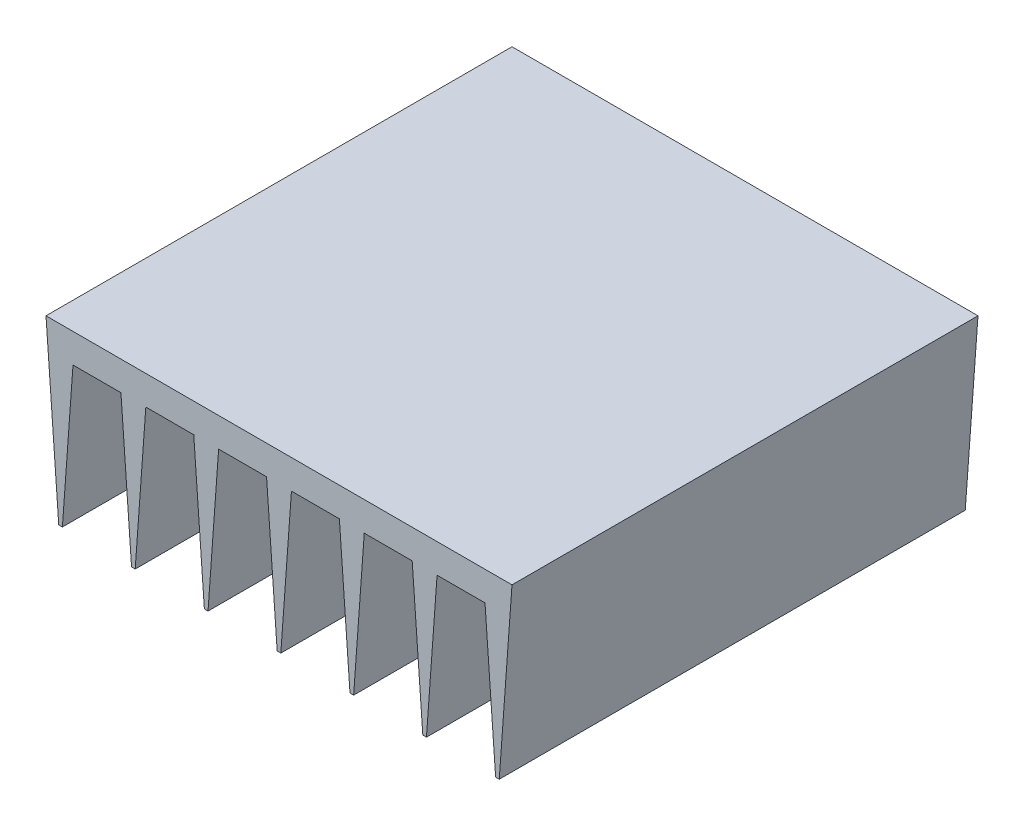
ISO-10303-21;
HEADER;
FILE_DESCRIPTION(('STEP AP214'),'2;1');
FILE_NAME('part.step','',(''),(''),'','','');
FILE_SCHEMA(('AUTOMOTIVE_DESIGN { 1 0 10303 214 1 1 1 1 }'));
ENDSEC;
DATA;
#1=APPLICATION_CONTEXT('core data for automotive mechanical design processes');
#2=APPLICATION_PROTOCOL_DEFINITION('international standard','automotive_design',2000,#1);
#3=PRODUCT_CONTEXT('',#1,'mechanical');
#4=PRODUCT('Part','Part','',(#3));
#5=PRODUCT_RELATED_PRODUCT_CATEGORY('part','',(#4));
#6=PRODUCT_DEFINITION_FORMATION('','',#4);
#7=PRODUCT_DEFINITION_CONTEXT('part definition',#1,'design');
#8=PRODUCT_DEFINITION('design','',#6,#7);
#9=PRODUCT_DEFINITION_SHAPE('','',#8);
#10=(LENGTH_UNIT() NAMED_UNIT(*) SI_UNIT(.MILLI.,.METRE.));
#11=(NAMED_UNIT(*) PLANE_ANGLE_UNIT() SI_UNIT($,.RADIAN.));
#12=(NAMED_UNIT(*) SI_UNIT($,.STERADIAN.) SOLID_ANGLE_UNIT());
#13=UNCERTAINTY_MEASURE_WITH_UNIT(LENGTH_MEASURE(1.E-05),#10,'distance_accuracy_value','');
#14=(GEOMETRIC_REPRESENTATION_CONTEXT(3) GLOBAL_UNCERTAINTY_ASSIGNED_CONTEXT((#13)) GLOBAL_UNIT_ASSIGNED_CONTEXT((#10,
#11,#12)) REPRESENTATION_CONTEXT('',''));
#15=CARTESIAN_POINT('',(0.,0.,0.));
#16=DIRECTION('',(0.,0.,1.));
#17=DIRECTION('',(1.,0.,0.));
#18=AXIS2_PLACEMENT_3D('',#15,#16,#17);
#19=CARTESIAN_POINT('',(-25.4,0.,25.4));
#20=DIRECTION('',(0.,-1.,0.));
#21=DIRECTION('',(1.,0.,0.));
#22=AXIS2_PLACEMENT_3D('',#19,#20,#21);
#23=PLANE('',#22);
#24=DIRECTION('',(-1.,0.,0.));
#25=VECTOR('',#24,1.);
#26=CARTESIAN_POINT('',(-25.4,0.,-25.4));
#27=LINE('',#26,#25);
#28=CARTESIAN_POINT('',(25.4,0.,-25.4));
#29=VERTEX_POINT('',#28);
#30=CARTESIAN_POINT('',(-25.4,0.,-25.4));
#31=VERTEX_POINT('',#30);
#32=EDGE_CURVE('E249',#29,#31,#27,.T.);
#33=ORIENTED_EDGE('',*,*,#32,.T.);
#34=DIRECTION('',(0.,0.,-1.));
#35=VECTOR('',#34,1.);
#36=CARTESIAN_POINT('',(-25.4,0.,25.4));
#37=LINE('',#36,#35);
#38=CARTESIAN_POINT('',(-25.4,0.,25.4));
#39=VERTEX_POINT('',#38);
#40=EDGE_CURVE('E11',#39,#31,#37,.T.);
#41=ORIENTED_EDGE('',*,*,#40,.F.);
#42=DIRECTION('',(-1.,0.,0.));
#43=VECTOR('',#42,1.);
#44=CARTESIAN_POINT('',(-25.4,0.,25.4));
#45=LINE('',#44,#43);
#46=CARTESIAN_POINT('',(25.4,0.,25.4));
#47=VERTEX_POINT('',#46);
#48=EDGE_CURVE('E303',#47,#39,#45,.T.);
#49=ORIENTED_EDGE('',*,*,#48,.F.);
#50=DIRECTION('',(0.,0.,-1.));
#51=VECTOR('',#50,1.);
#52=CARTESIAN_POINT('',(25.4,0.,25.4));
#53=LINE('',#52,#51);
#54=EDGE_CURVE('E245',#47,#29,#53,.T.);
#55=ORIENTED_EDGE('',*,*,#54,.T.);
#56=EDGE_LOOP('',(#33,#41,#49,#55));
#57=FACE_BOUND('',#56,.T.);
#58=ADVANCED_FACE('F33',(#57),#23,.F.);
#59=CARTESIAN_POINT('',(-25.4,0.,25.4));
#60=DIRECTION('',(0.997352133906082,0.0727235930973187,0.));
#61=DIRECTION('',(-0.0727235930973187,0.997352133906082,0.));
#62=AXIS2_PLACEMENT_3D('',#59,#60,#61);
#63=PLANE('',#62);
#64=DIRECTION('',(0.0727235930973187,-0.997352133906082,0.));
#65=VECTOR('',#64,1.);
#66=CARTESIAN_POINT('',(-25.4,0.,-25.4));
#67=LINE('',#66,#65);
#68=CARTESIAN_POINT('',(-24.0109375,-19.05,-25.4));
#69=VERTEX_POINT('',#68);
#70=EDGE_CURVE('E252',#31,#69,#67,.T.);
#71=ORIENTED_EDGE('',*,*,#70,.T.);
#72=DIRECTION('',(0.,0.,-1.));
#73=VECTOR('',#72,1.);
#74=CARTESIAN_POINT('',(-24.0109375,-19.05,25.4));
#75=LINE('',#74,#73);
#76=CARTESIAN_POINT('',(-24.0109375,-19.05,25.4));
#77=VERTEX_POINT('',#76);
#78=EDGE_CURVE('E41',#77,#69,#75,.T.);
#79=ORIENTED_EDGE('',*,*,#78,.F.);
#80=DIRECTION('',(0.0727235930973187,-0.997352133906082,0.));
#81=VECTOR('',#80,1.);
#82=CARTESIAN_POINT('',(-25.4,0.,25.4));
#83=LINE('',#82,#81);
#84=EDGE_CURVE('E152',#39,#77,#83,.T.);
#85=ORIENTED_EDGE('',*,*,#84,.F.);
#86=ORIENTED_EDGE('',*,*,#40,.T.);
#87=EDGE_LOOP('',(#71,#79,#85,#86));
#88=FACE_BOUND('',#87,.T.);
#89=ADVANCED_FACE('F461',(#88),#63,.F.);
#90=CARTESIAN_POINT('',(-24.0109375,-19.05,25.4));
#91=DIRECTION('',(0.,1.,0.));
#92=DIRECTION('',(0.,0.,1.));
#93=AXIS2_PLACEMENT_3D('',#90,#91,#92);
#94=PLANE('',#93);
#95=DIRECTION('',(1.,0.,0.));
#96=VECTOR('',#95,1.);
#97=CARTESIAN_POINT('',(-24.0109375,-19.05,-25.4));
#98=LINE('',#97,#96);
#99=CARTESIAN_POINT('',(-23.6140625,-19.05,-25.4));
#100=VERTEX_POINT('',#99);
#101=EDGE_CURVE('E254',#69,#100,#98,.T.);
#102=ORIENTED_EDGE('',*,*,#101,.T.);
#103=DIRECTION('',(0.,0.,-1.));
#104=VECTOR('',#103,1.);
#105=CARTESIAN_POINT('',(-23.6140625,-19.05,25.4));
#106=LINE('',#105,#104);
#107=CARTESIAN_POINT('',(-23.6140625,-19.05,25.4));
#108=VERTEX_POINT('',#107);
#109=EDGE_CURVE('E370',#108,#100,#106,.T.);
#110=ORIENTED_EDGE('',*,*,#109,.F.);
#111=DIRECTION('',(1.,0.,0.));
#112=VECTOR('',#111,1.);
#113=CARTESIAN_POINT('',(-24.0109375,-19.05,25.4));
#114=LINE('',#113,#112);
#115=EDGE_CURVE('E378',#77,#108,#114,.T.);
#116=ORIENTED_EDGE('',*,*,#115,.F.);
#117=ORIENTED_EDGE('',*,*,#78,.T.);
#118=EDGE_LOOP('',(#102,#110,#116,#117));
#119=FACE_BOUND('',#118,.T.);
#120=ADVANCED_FACE('F376',(#119),#94,.F.);
#121=CARTESIAN_POINT('',(-22.4565104166667,-3.175,25.4));
#122=DIRECTION('',(-0.997352133906082,0.0727235930973184,0.));
#123=DIRECTION('',(-0.0727235930973184,-0.997352133906082,0.));
#124=AXIS2_PLACEMENT_3D('',#121,#122,#123);
#125=PLANE('',#124);
#126=DIRECTION('',(0.0727235930973184,0.997352133906082,0.));
#127=VECTOR('',#126,1.);
#128=CARTESIAN_POINT('',(-22.4565104166667,-3.175,-25.4));
#129=LINE('',#128,#127);
#130=CARTESIAN_POINT('',(-22.4565104166667,-3.175,-25.4));
#131=VERTEX_POINT('',#130);
#132=EDGE_CURVE('E256',#100,#131,#129,.T.);
#133=ORIENTED_EDGE('',*,*,#132,.T.);
#134=DIRECTION('',(0.,0.,-1.));
#135=VECTOR('',#134,1.);
#136=CARTESIAN_POINT('',(-22.4565104166667,-3.175,25.4));
#137=LINE('',#136,#135);
#138=CARTESIAN_POINT('',(-22.4565104166667,-3.175,25.4));
#139=VERTEX_POINT('',#138);
#140=EDGE_CURVE('E367',#139,#131,#137,.T.);
#141=ORIENTED_EDGE('',*,*,#140,.F.);
#142=DIRECTION('',(0.0727235930973184,0.997352133906082,0.));
#143=VECTOR('',#142,1.);
#144=CARTESIAN_POINT('',(-22.4565104166667,-3.175,25.4));
#145=LINE('',#144,#143);
#146=EDGE_CURVE('E396',#108,#139,#145,.T.);
#147=ORIENTED_EDGE('',*,*,#146,.F.);
#148=ORIENTED_EDGE('',*,*,#109,.T.);
#149=EDGE_LOOP('',(#133,#141,#147,#148));
#150=FACE_BOUND('',#149,.T.);
#151=ADVANCED_FACE('F387',(#150),#125,.F.);
#152=CARTESIAN_POINT('',(-22.4565104166667,-3.175,25.4));
#153=DIRECTION('',(0.,1.,0.));
#154=DIRECTION('',(0.,0.,1.));
#155=AXIS2_PLACEMENT_3D('',#152,#153,#154);
#156=PLANE('',#155);
#157=DIRECTION('',(1.,0.,0.));
#158=VECTOR('',#157,1.);
#159=CARTESIAN_POINT('',(-22.4565104166667,-3.175,-25.4));
#160=LINE('',#159,#158);
#161=CARTESIAN_POINT('',(-17.2309895833333,-3.175,-25.4));
#162=VERTEX_POINT('',#161);
#163=EDGE_CURVE('E258',#131,#162,#160,.T.);
#164=ORIENTED_EDGE('',*,*,#163,.T.);
#165=DIRECTION('',(0.,0.,-1.));
#166=VECTOR('',#165,1.);
#167=CARTESIAN_POINT('',(-17.2309895833333,-3.175,25.4));
#168=LINE('',#167,#166);
#169=CARTESIAN_POINT('',(-17.2309895833333,-3.175,25.4));
#170=VERTEX_POINT('',#169);
#171=EDGE_CURVE('E364',#170,#162,#168,.T.);
#172=ORIENTED_EDGE('',*,*,#171,.F.);
#173=DIRECTION('',(1.,0.,0.));
#174=VECTOR('',#173,1.);
#175=CARTESIAN_POINT('',(-22.4565104166667,-3.175,25.4));
#176=LINE('',#175,#174);
#177=EDGE_CURVE('E393',#139,#170,#176,.T.);
#178=ORIENTED_EDGE('',*,*,#177,.F.);
#179=ORIENTED_EDGE('',*,*,#140,.T.);
#180=EDGE_LOOP('',(#164,#172,#178,#179));
#181=FACE_BOUND('',#180,.T.);
#182=ADVANCED_FACE('F391',(#181),#156,.F.);
#183=CARTESIAN_POINT('',(-17.2309895833333,-3.175,25.4));
#184=DIRECTION('',(0.997352133906082,0.0727235930973187,0.));
#185=DIRECTION('',(-0.0727235930973187,0.997352133906082,0.));
#186=AXIS2_PLACEMENT_3D('',#183,#184,#185);
#187=PLANE('',#186);
#188=DIRECTION('',(0.0727235930973187,-0.997352133906082,0.));
#189=VECTOR('',#188,1.);
#190=CARTESIAN_POINT('',(-17.2309895833333,-3.175,-25.4));
#191=LINE('',#190,#189);
#192=CARTESIAN_POINT('',(-16.0734375,-19.05,-25.4));
#193=VERTEX_POINT('',#192);
#194=EDGE_CURVE('E260',#162,#193,#191,.T.);
#195=ORIENTED_EDGE('',*,*,#194,.T.);
#196=DIRECTION('',(0.,0.,-1.));
#197=VECTOR('',#196,1.);
#198=CARTESIAN_POINT('',(-16.0734375,-19.05,25.4));
#199=LINE('',#198,#197);
#200=CARTESIAN_POINT('',(-16.0734375,-19.05,25.4));
#201=VERTEX_POINT('',#200);
#202=EDGE_CURVE('E361',#201,#193,#199,.T.);
#203=ORIENTED_EDGE('',*,*,#202,.F.);
#204=DIRECTION('',(0.0727235930973187,-0.997352133906082,0.));
#205=VECTOR('',#204,1.);
#206=CARTESIAN_POINT('',(-17.2309895833333,-3.175,25.4));
#207=LINE('',#206,#205);
#208=EDGE_CURVE('E395',#170,#201,#207,.T.);
#209=ORIENTED_EDGE('',*,*,#208,.F.);
#210=ORIENTED_EDGE('',*,*,#171,.T.);
#211=EDGE_LOOP('',(#195,#203,#209,#210));
#212=FACE_BOUND('',#211,.T.);
#213=ADVANCED_FACE('F474',(#212),#187,.F.);
#214=CARTESIAN_POINT('',(-16.0734375,-19.05,25.4));
#215=DIRECTION('',(0.,1.,0.));
#216=DIRECTION('',(0.,0.,1.));
#217=AXIS2_PLACEMENT_3D('',#214,#215,#216);
#218=PLANE('',#217);
#219=DIRECTION('',(1.,0.,0.));
#220=VECTOR('',#219,1.);
#221=CARTESIAN_POINT('',(-16.0734375,-19.05,-25.4));
#222=LINE('',#221,#220);
#223=CARTESIAN_POINT('',(-15.6765625,-19.05,-25.4));
#224=VERTEX_POINT('',#223);
#225=EDGE_CURVE('E262',#193,#224,#222,.T.);
#226=ORIENTED_EDGE('',*,*,#225,.T.);
#227=DIRECTION('',(0.,0.,-1.));
#228=VECTOR('',#227,1.);
#229=CARTESIAN_POINT('',(-15.6765625,-19.05,25.4));
#230=LINE('',#229,#228);
#231=CARTESIAN_POINT('',(-15.6765625,-19.05,25.4));
#232=VERTEX_POINT('',#231);
#233=EDGE_CURVE('E358',#232,#224,#230,.T.);
#234=ORIENTED_EDGE('',*,*,#233,.F.);
#235=DIRECTION('',(1.,0.,0.));
#236=VECTOR('',#235,1.);
#237=CARTESIAN_POINT('',(-16.0734375,-19.05,25.4));
#238=LINE('',#237,#236);
#239=EDGE_CURVE('E398',#201,#232,#238,.T.);
#240=ORIENTED_EDGE('',*,*,#239,.F.);
#241=ORIENTED_EDGE('',*,*,#202,.T.);
#242=EDGE_LOOP('',(#226,#234,#240,#241));
#243=FACE_BOUND('',#242,.T.);
#244=ADVANCED_FACE('F477',(#243),#218,.F.);
#245=CARTESIAN_POINT('',(-14.5190104166667,-3.175,25.4));
#246=DIRECTION('',(-0.997352133906082,0.0727235930973184,0.));
#247=DIRECTION('',(-0.0727235930973184,-0.997352133906082,0.));
#248=AXIS2_PLACEMENT_3D('',#245,#246,#247);
#249=PLANE('',#248);
#250=DIRECTION('',(0.0727235930973184,0.997352133906082,0.));
#251=VECTOR('',#250,1.);
#252=CARTESIAN_POINT('',(-14.5190104166667,-3.175,-25.4));
#253=LINE('',#252,#251);
#254=CARTESIAN_POINT('',(-14.5190104166667,-3.175,-25.4));
#255=VERTEX_POINT('',#254);
#256=EDGE_CURVE('E264',#224,#255,#253,.T.);
#257=ORIENTED_EDGE('',*,*,#256,.T.);
#258=DIRECTION('',(0.,0.,-1.));
#259=VECTOR('',#258,1.);
#260=CARTESIAN_POINT('',(-14.5190104166667,-3.175,25.4));
#261=LINE('',#260,#259);
#262=CARTESIAN_POINT('',(-14.5190104166667,-3.175,25.4));
#263=VERTEX_POINT('',#262);
#264=EDGE_CURVE('E355',#263,#255,#261,.T.);
#265=ORIENTED_EDGE('',*,*,#264,.F.);
#266=DIRECTION('',(0.0727235930973184,0.997352133906082,0.));
#267=VECTOR('',#266,1.);
#268=CARTESIAN_POINT('',(-14.5190104166667,-3.175,25.4));
#269=LINE('',#268,#267);
#270=EDGE_CURVE('E404',#232,#263,#269,.T.);
#271=ORIENTED_EDGE('',*,*,#270,.F.);
#272=ORIENTED_EDGE('',*,*,#233,.T.);
#273=EDGE_LOOP('',(#257,#265,#271,#272));
#274=FACE_BOUND('',#273,.T.);
#275=ADVANCED_FACE('F481',(#274),#249,.F.);
#276=CARTESIAN_POINT('',(-14.5190104166667,-3.175,25.4));
#277=DIRECTION('',(0.,1.,0.));
#278=DIRECTION('',(0.,0.,1.));
#279=AXIS2_PLACEMENT_3D('',#276,#277,#278);
#280=PLANE('',#279);
#281=DIRECTION('',(1.,0.,0.));
#282=VECTOR('',#281,1.);
#283=CARTESIAN_POINT('',(-14.5190104166667,-3.175,-25.4));
#284=LINE('',#283,#282);
#285=CARTESIAN_POINT('',(-9.29348958333333,-3.175,-25.4));
#286=VERTEX_POINT('',#285);
#287=EDGE_CURVE('E266',#255,#286,#284,.T.);
#288=ORIENTED_EDGE('',*,*,#287,.T.);
#289=DIRECTION('',(0.,0.,-1.));
#290=VECTOR('',#289,1.);
#291=CARTESIAN_POINT('',(-9.29348958333333,-3.175,25.4));
#292=LINE('',#291,#290);
#293=CARTESIAN_POINT('',(-9.29348958333333,-3.175,25.4));
#294=VERTEX_POINT('',#293);
#295=EDGE_CURVE('E352',#294,#286,#292,.T.);
#296=ORIENTED_EDGE('',*,*,#295,.F.);
#297=DIRECTION('',(1.,0.,0.));
#298=VECTOR('',#297,1.);
#299=CARTESIAN_POINT('',(-14.5190104166667,-3.175,25.4));
#300=LINE('',#299,#298);
#301=EDGE_CURVE('E406',#263,#294,#300,.T.);
#302=ORIENTED_EDGE('',*,*,#301,.F.);
#303=ORIENTED_EDGE('',*,*,#264,.T.);
#304=EDGE_LOOP('',(#288,#296,#302,#303));
#305=FACE_BOUND('',#304,.T.);
#306=ADVANCED_FACE('F485',(#305),#280,.F.);
#307=CARTESIAN_POINT('',(-9.29348958333333,-3.175,25.4));
#308=DIRECTION('',(0.997352133906082,0.0727235930973187,0.));
#309=DIRECTION('',(-0.0727235930973187,0.997352133906082,0.));
#310=AXIS2_PLACEMENT_3D('',#307,#308,#309);
#311=PLANE('',#310);
#312=DIRECTION('',(0.0727235930973187,-0.997352133906082,0.));
#313=VECTOR('',#312,1.);
#314=CARTESIAN_POINT('',(-9.29348958333333,-3.175,-25.4));
#315=LINE('',#314,#313);
#316=CARTESIAN_POINT('',(-8.1359375,-19.05,-25.4));
#317=VERTEX_POINT('',#316);
#318=EDGE_CURVE('E268',#286,#317,#315,.T.);
#319=ORIENTED_EDGE('',*,*,#318,.T.);
#320=DIRECTION('',(0.,0.,-1.));
#321=VECTOR('',#320,1.);
#322=CARTESIAN_POINT('',(-8.1359375,-19.05,25.4));
#323=LINE('',#322,#321);
#324=CARTESIAN_POINT('',(-8.1359375,-19.05,25.4));
#325=VERTEX_POINT('',#324);
#326=EDGE_CURVE('E349',#325,#317,#323,.T.);
#327=ORIENTED_EDGE('',*,*,#326,.F.);
#328=DIRECTION('',(0.0727235930973187,-0.997352133906082,0.));
#329=VECTOR('',#328,1.);
#330=CARTESIAN_POINT('',(-9.29348958333333,-3.175,25.4));
#331=LINE('',#330,#329);
#332=EDGE_CURVE('E408',#294,#325,#331,.T.);
#333=ORIENTED_EDGE('',*,*,#332,.F.);
#334=ORIENTED_EDGE('',*,*,#295,.T.);
#335=EDGE_LOOP('',(#319,#327,#333,#334));
#336=FACE_BOUND('',#335,.T.);
#337=ADVANCED_FACE('F489',(#336),#311,.F.);
#338=CARTESIAN_POINT('',(-8.1359375,-19.05,25.4));
#339=DIRECTION('',(0.,1.,0.));
#340=DIRECTION('',(0.,0.,1.));
#341=AXIS2_PLACEMENT_3D('',#338,#339,#340);
#342=PLANE('',#341);
#343=DIRECTION('',(1.,0.,0.));
#344=VECTOR('',#343,1.);
#345=CARTESIAN_POINT('',(-8.1359375,-19.05,-25.4));
#346=LINE('',#345,#344);
#347=CARTESIAN_POINT('',(-7.7390625,-19.05,-25.4));
#348=VERTEX_POINT('',#347);
#349=EDGE_CURVE('E270',#317,#348,#346,.T.);
#350=ORIENTED_EDGE('',*,*,#349,.T.);
#351=DIRECTION('',(0.,0.,-1.));
#352=VECTOR('',#351,1.);
#353=CARTESIAN_POINT('',(-7.7390625,-19.05,25.4));
#354=LINE('',#353,#352);
#355=CARTESIAN_POINT('',(-7.7390625,-19.05,25.4));
#356=VERTEX_POINT('',#355);
#357=EDGE_CURVE('E346',#356,#348,#354,.T.);
#358=ORIENTED_EDGE('',*,*,#357,.F.);
#359=DIRECTION('',(1.,0.,0.));
#360=VECTOR('',#359,1.);
#361=CARTESIAN_POINT('',(-8.1359375,-19.05,25.4));
#362=LINE('',#361,#360);
#363=EDGE_CURVE('E410',#325,#356,#362,.T.);
#364=ORIENTED_EDGE('',*,*,#363,.F.);
#365=ORIENTED_EDGE('',*,*,#326,.T.);
#366=EDGE_LOOP('',(#350,#358,#364,#365));
#367=FACE_BOUND('',#366,.T.);
#368=ADVANCED_FACE('F493',(#367),#342,.F.);
#369=CARTESIAN_POINT('',(-6.58151041666667,-3.175,25.4));
#370=DIRECTION('',(-0.997352133906082,0.0727235930973184,0.));
#371=DIRECTION('',(-0.0727235930973184,-0.997352133906082,0.));
#372=AXIS2_PLACEMENT_3D('',#369,#370,#371);
#373=PLANE('',#372);
#374=DIRECTION('',(0.0727235930973184,0.997352133906082,0.));
#375=VECTOR('',#374,1.);
#376=CARTESIAN_POINT('',(-6.58151041666667,-3.175,-25.4));
#377=LINE('',#376,#375);
#378=CARTESIAN_POINT('',(-6.58151041666667,-3.175,-25.4));
#379=VERTEX_POINT('',#378);
#380=EDGE_CURVE('E272',#348,#379,#377,.T.);
#381=ORIENTED_EDGE('',*,*,#380,.T.);
#382=DIRECTION('',(0.,0.,-1.));
#383=VECTOR('',#382,1.);
#384=CARTESIAN_POINT('',(-6.58151041666667,-3.175,25.4));
#385=LINE('',#384,#383);
#386=CARTESIAN_POINT('',(-6.58151041666667,-3.175,25.4));
#387=VERTEX_POINT('',#386);
#388=EDGE_CURVE('E343',#387,#379,#385,.T.);
#389=ORIENTED_EDGE('',*,*,#388,.F.);
#390=DIRECTION('',(0.0727235930973184,0.997352133906082,0.));
#391=VECTOR('',#390,1.);
#392=CARTESIAN_POINT('',(-6.58151041666667,-3.175,25.4));
#393=LINE('',#392,#391);
#394=EDGE_CURVE('E412',#356,#387,#393,.T.);
#395=ORIENTED_EDGE('',*,*,#394,.F.);
#396=ORIENTED_EDGE('',*,*,#357,.T.);
#397=EDGE_LOOP('',(#381,#389,#395,#396));
#398=FACE_BOUND('',#397,.T.);
#399=ADVANCED_FACE('F497',(#398),#373,.F.);
#400=CARTESIAN_POINT('',(-6.58151041666667,-3.175,25.4));
#401=DIRECTION('',(0.,1.,0.));
#402=DIRECTION('',(0.,0.,1.));
#403=AXIS2_PLACEMENT_3D('',#400,#401,#402);
#404=PLANE('',#403);
#405=DIRECTION('',(1.,0.,0.));
#406=VECTOR('',#405,1.);
#407=CARTESIAN_POINT('',(-6.58151041666667,-3.175,-25.4));
#408=LINE('',#407,#406);
#409=CARTESIAN_POINT('',(-1.35598958333333,-3.175,-25.4));
#410=VERTEX_POINT('',#409);
#411=EDGE_CURVE('E274',#379,#410,#408,.T.);
#412=ORIENTED_EDGE('',*,*,#411,.T.);
#413=DIRECTION('',(0.,0.,-1.));
#414=VECTOR('',#413,1.);
#415=CARTESIAN_POINT('',(-1.35598958333333,-3.175,25.4));
#416=LINE('',#415,#414);
#417=CARTESIAN_POINT('',(-1.35598958333333,-3.175,25.4));
#418=VERTEX_POINT('',#417);
#419=EDGE_CURVE('E340',#418,#410,#416,.T.);
#420=ORIENTED_EDGE('',*,*,#419,.F.);
#421=DIRECTION('',(1.,0.,0.));
#422=VECTOR('',#421,1.);
#423=CARTESIAN_POINT('',(-6.58151041666667,-3.175,25.4));
#424=LINE('',#423,#422);
#425=EDGE_CURVE('E414',#387,#418,#424,.T.);
#426=ORIENTED_EDGE('',*,*,#425,.F.);
#427=ORIENTED_EDGE('',*,*,#388,.T.);
#428=EDGE_LOOP('',(#412,#420,#426,#427));
#429=FACE_BOUND('',#428,.T.);
#430=ADVANCED_FACE('F501',(#429),#404,.F.);
#431=CARTESIAN_POINT('',(-1.35598958333333,-3.175,25.4));
#432=DIRECTION('',(0.997352133906082,0.0727235930973187,0.));
#433=DIRECTION('',(-0.0727235930973187,0.997352133906082,0.));
#434=AXIS2_PLACEMENT_3D('',#431,#432,#433);
#435=PLANE('',#434);
#436=DIRECTION('',(0.0727235930973187,-0.997352133906082,0.));
#437=VECTOR('',#436,1.);
#438=CARTESIAN_POINT('',(-1.35598958333333,-3.175,-25.4));
#439=LINE('',#438,#437);
#440=CARTESIAN_POINT('',(-0.198437499999995,-19.05,-25.4));
#441=VERTEX_POINT('',#440);
#442=EDGE_CURVE('E276',#410,#441,#439,.T.);
#443=ORIENTED_EDGE('',*,*,#442,.T.);
#444=DIRECTION('',(0.,0.,-1.));
#445=VECTOR('',#444,1.);
#446=CARTESIAN_POINT('',(-0.198437499999995,-19.05,25.4));
#447=LINE('',#446,#445);
#448=CARTESIAN_POINT('',(-0.198437499999995,-19.05,25.4));
#449=VERTEX_POINT('',#448);
#450=EDGE_CURVE('E337',#449,#441,#447,.T.);
#451=ORIENTED_EDGE('',*,*,#450,.F.);
#452=DIRECTION('',(0.0727235930973187,-0.997352133906082,0.));
#453=VECTOR('',#452,1.);
#454=CARTESIAN_POINT('',(-1.35598958333333,-3.175,25.4));
#455=LINE('',#454,#453);
#456=EDGE_CURVE('E416',#418,#449,#455,.T.);
#457=ORIENTED_EDGE('',*,*,#456,.F.);
#458=ORIENTED_EDGE('',*,*,#419,.T.);
#459=EDGE_LOOP('',(#443,#451,#457,#458));
#460=FACE_BOUND('',#459,.T.);
#461=ADVANCED_FACE('F505',(#460),#435,.F.);
#462=CARTESIAN_POINT('',(-0.198437499999995,-19.05,25.4));
#463=DIRECTION('',(0.,1.,0.));
#464=DIRECTION('',(0.,0.,1.));
#465=AXIS2_PLACEMENT_3D('',#462,#463,#464);
#466=PLANE('',#465);
#467=DIRECTION('',(1.,0.,0.));
#468=VECTOR('',#467,1.);
#469=CARTESIAN_POINT('',(-0.198437499999995,-19.05,-25.4));
#470=LINE('',#469,#468);
#471=CARTESIAN_POINT('',(0.198437500000002,-19.05,-25.4));
#472=VERTEX_POINT('',#471);
#473=EDGE_CURVE('E278',#441,#472,#470,.T.);
#474=ORIENTED_EDGE('',*,*,#473,.T.);
#475=DIRECTION('',(0.,0.,-1.));
#476=VECTOR('',#475,1.);
#477=CARTESIAN_POINT('',(0.198437500000002,-19.05,25.4));
#478=LINE('',#477,#476);
#479=CARTESIAN_POINT('',(0.198437500000002,-19.05,25.4));
#480=VERTEX_POINT('',#479);
#481=EDGE_CURVE('E334',#480,#472,#478,.T.);
#482=ORIENTED_EDGE('',*,*,#481,.F.);
#483=DIRECTION('',(1.,0.,0.));
#484=VECTOR('',#483,1.);
#485=CARTESIAN_POINT('',(-0.198437499999995,-19.05,25.4));
#486=LINE('',#485,#484);
#487=EDGE_CURVE('E418',#449,#480,#486,.T.);
#488=ORIENTED_EDGE('',*,*,#487,.F.);
#489=ORIENTED_EDGE('',*,*,#450,.T.);
#490=EDGE_LOOP('',(#474,#482,#488,#489));
#491=FACE_BOUND('',#490,.T.);
#492=ADVANCED_FACE('F509',(#491),#466,.F.);
#493=CARTESIAN_POINT('',(1.35598958333334,-3.175,25.4));
#494=DIRECTION('',(-0.997352133906082,0.0727235930973185,0.));
#495=DIRECTION('',(-0.0727235930973185,-0.997352133906082,0.));
#496=AXIS2_PLACEMENT_3D('',#493,#494,#495);
#497=PLANE('',#496);
#498=DIRECTION('',(0.0727235930973185,0.997352133906082,0.));
#499=VECTOR('',#498,1.);
#500=CARTESIAN_POINT('',(1.35598958333334,-3.175,-25.4));
#501=LINE('',#500,#499);
#502=CARTESIAN_POINT('',(1.35598958333334,-3.175,-25.4));
#503=VERTEX_POINT('',#502);
#504=EDGE_CURVE('E280',#472,#503,#501,.T.);
#505=ORIENTED_EDGE('',*,*,#504,.T.);
#506=DIRECTION('',(0.,0.,-1.));
#507=VECTOR('',#506,1.);
#508=CARTESIAN_POINT('',(1.35598958333334,-3.175,25.4));
#509=LINE('',#508,#507);
#510=CARTESIAN_POINT('',(1.35598958333334,-3.175,25.4));
#511=VERTEX_POINT('',#510);
#512=EDGE_CURVE('E331',#511,#503,#509,.T.);
#513=ORIENTED_EDGE('',*,*,#512,.F.);
#514=DIRECTION('',(0.0727235930973185,0.997352133906082,0.));
#515=VECTOR('',#514,1.);
#516=CARTESIAN_POINT('',(1.35598958333334,-3.175,25.4));
#517=LINE('',#516,#515);
#518=EDGE_CURVE('E420',#480,#511,#517,.T.);
#519=ORIENTED_EDGE('',*,*,#518,.F.);
#520=ORIENTED_EDGE('',*,*,#481,.T.);
#521=EDGE_LOOP('',(#505,#513,#519,#520));
#522=FACE_BOUND('',#521,.T.);
#523=ADVANCED_FACE('F513',(#522),#497,.F.);
#524=CARTESIAN_POINT('',(1.35598958333334,-3.175,25.4));
#525=DIRECTION('',(0.,1.,0.));
#526=DIRECTION('',(0.,0.,1.));
#527=AXIS2_PLACEMENT_3D('',#524,#525,#526);
#528=PLANE('',#527);
#529=DIRECTION('',(1.,0.,0.));
#530=VECTOR('',#529,1.);
#531=CARTESIAN_POINT('',(1.35598958333334,-3.175,-25.4));
#532=LINE('',#531,#530);
#533=CARTESIAN_POINT('',(6.58151041666667,-3.175,-25.4));
#534=VERTEX_POINT('',#533);
#535=EDGE_CURVE('E282',#503,#534,#532,.T.);
#536=ORIENTED_EDGE('',*,*,#535,.T.);
#537=DIRECTION('',(0.,0.,-1.));
#538=VECTOR('',#537,1.);
#539=CARTESIAN_POINT('',(6.58151041666667,-3.175,25.4));
#540=LINE('',#539,#538);
#541=CARTESIAN_POINT('',(6.58151041666667,-3.175,25.4));
#542=VERTEX_POINT('',#541);
#543=EDGE_CURVE('E328',#542,#534,#540,.T.);
#544=ORIENTED_EDGE('',*,*,#543,.F.);
#545=DIRECTION('',(1.,0.,0.));
#546=VECTOR('',#545,1.);
#547=CARTESIAN_POINT('',(1.35598958333334,-3.175,25.4));
#548=LINE('',#547,#546);
#549=EDGE_CURVE('E422',#511,#542,#548,.T.);
#550=ORIENTED_EDGE('',*,*,#549,.F.);
#551=ORIENTED_EDGE('',*,*,#512,.T.);
#552=EDGE_LOOP('',(#536,#544,#550,#551));
#553=FACE_BOUND('',#552,.T.);
#554=ADVANCED_FACE('F517',(#553),#528,.F.);
#555=CARTESIAN_POINT('',(6.58151041666667,-3.175,25.4));
#556=DIRECTION('',(0.997352133906082,0.0727235930973187,0.));
#557=DIRECTION('',(-0.0727235930973187,0.997352133906082,0.));
#558=AXIS2_PLACEMENT_3D('',#555,#556,#557);
#559=PLANE('',#558);
#560=DIRECTION('',(0.0727235930973187,-0.997352133906082,0.));
#561=VECTOR('',#560,1.);
#562=CARTESIAN_POINT('',(6.58151041666667,-3.175,-25.4));
#563=LINE('',#562,#561);
#564=CARTESIAN_POINT('',(7.7390625,-19.05,-25.4));
#565=VERTEX_POINT('',#564);
#566=EDGE_CURVE('E284',#534,#565,#563,.T.);
#567=ORIENTED_EDGE('',*,*,#566,.T.);
#568=DIRECTION('',(0.,0.,-1.));
#569=VECTOR('',#568,1.);
#570=CARTESIAN_POINT('',(7.7390625,-19.05,25.4));
#571=LINE('',#570,#569);
#572=CARTESIAN_POINT('',(7.7390625,-19.05,25.4));
#573=VERTEX_POINT('',#572);
#574=EDGE_CURVE('E325',#573,#565,#571,.T.);
#575=ORIENTED_EDGE('',*,*,#574,.F.);
#576=DIRECTION('',(0.0727235930973187,-0.997352133906082,0.));
#577=VECTOR('',#576,1.);
#578=CARTESIAN_POINT('',(6.58151041666667,-3.175,25.4));
#579=LINE('',#578,#577);
#580=EDGE_CURVE('E424',#542,#573,#579,.T.);
#581=ORIENTED_EDGE('',*,*,#580,.F.);
#582=ORIENTED_EDGE('',*,*,#543,.T.);
#583=EDGE_LOOP('',(#567,#575,#581,#582));
#584=FACE_BOUND('',#583,.T.);
#585=ADVANCED_FACE('F521',(#584),#559,.F.);
#586=CARTESIAN_POINT('',(7.7390625,-19.05,25.4));
#587=DIRECTION('',(0.,1.,0.));
#588=DIRECTION('',(0.,0.,1.));
#589=AXIS2_PLACEMENT_3D('',#586,#587,#588);
#590=PLANE('',#589);
#591=DIRECTION('',(1.,0.,0.));
#592=VECTOR('',#591,1.);
#593=CARTESIAN_POINT('',(7.7390625,-19.05,-25.4));
#594=LINE('',#593,#592);
#595=CARTESIAN_POINT('',(8.1359375,-19.05,-25.4));
#596=VERTEX_POINT('',#595);
#597=EDGE_CURVE('E286',#565,#596,#594,.T.);
#598=ORIENTED_EDGE('',*,*,#597,.T.);
#599=DIRECTION('',(0.,0.,-1.));
#600=VECTOR('',#599,1.);
#601=CARTESIAN_POINT('',(8.1359375,-19.05,25.4));
#602=LINE('',#601,#600);
#603=CARTESIAN_POINT('',(8.1359375,-19.05,25.4));
#604=VERTEX_POINT('',#603);
#605=EDGE_CURVE('E322',#604,#596,#602,.T.);
#606=ORIENTED_EDGE('',*,*,#605,.F.);
#607=DIRECTION('',(1.,0.,0.));
#608=VECTOR('',#607,1.);
#609=CARTESIAN_POINT('',(7.7390625,-19.05,25.4));
#610=LINE('',#609,#608);
#611=EDGE_CURVE('E426',#573,#604,#610,.T.);
#612=ORIENTED_EDGE('',*,*,#611,.F.);
#613=ORIENTED_EDGE('',*,*,#574,.T.);
#614=EDGE_LOOP('',(#598,#606,#612,#613));
#615=FACE_BOUND('',#614,.T.);
#616=ADVANCED_FACE('F525',(#615),#590,.F.);
#617=CARTESIAN_POINT('',(9.29348958333333,-3.175,25.4));
#618=DIRECTION('',(-0.997352133906082,0.0727235930973184,0.));
#619=DIRECTION('',(-0.0727235930973184,-0.997352133906082,0.));
#620=AXIS2_PLACEMENT_3D('',#617,#618,#619);
#621=PLANE('',#620);
#622=DIRECTION('',(0.0727235930973184,0.997352133906082,0.));
#623=VECTOR('',#622,1.);
#624=CARTESIAN_POINT('',(9.29348958333333,-3.175,-25.4));
#625=LINE('',#624,#623);
#626=CARTESIAN_POINT('',(9.29348958333333,-3.175,-25.4));
#627=VERTEX_POINT('',#626);
#628=EDGE_CURVE('E288',#596,#627,#625,.T.);
#629=ORIENTED_EDGE('',*,*,#628,.T.);
#630=DIRECTION('',(0.,0.,-1.));
#631=VECTOR('',#630,1.);
#632=CARTESIAN_POINT('',(9.29348958333333,-3.175,25.4));
#633=LINE('',#632,#631);
#634=CARTESIAN_POINT('',(9.29348958333333,-3.175,25.4));
#635=VERTEX_POINT('',#634);
#636=EDGE_CURVE('E319',#635,#627,#633,.T.);
#637=ORIENTED_EDGE('',*,*,#636,.F.);
#638=DIRECTION('',(0.0727235930973184,0.997352133906082,0.));
#639=VECTOR('',#638,1.);
#640=CARTESIAN_POINT('',(9.29348958333333,-3.175,25.4));
#641=LINE('',#640,#639);
#642=EDGE_CURVE('E428',#604,#635,#641,.T.);
#643=ORIENTED_EDGE('',*,*,#642,.F.);
#644=ORIENTED_EDGE('',*,*,#605,.T.);
#645=EDGE_LOOP('',(#629,#637,#643,#644));
#646=FACE_BOUND('',#645,.T.);
#647=ADVANCED_FACE('F529',(#646),#621,.F.);
#648=CARTESIAN_POINT('',(9.29348958333333,-3.175,25.4));
#649=DIRECTION('',(0.,1.,0.));
#650=DIRECTION('',(0.,0.,1.));
#651=AXIS2_PLACEMENT_3D('',#648,#649,#650);
#652=PLANE('',#651);
#653=DIRECTION('',(1.,0.,0.));
#654=VECTOR('',#653,1.);
#655=CARTESIAN_POINT('',(9.29348958333333,-3.175,-25.4));
#656=LINE('',#655,#654);
#657=CARTESIAN_POINT('',(14.5190104166667,-3.175,-25.4));
#658=VERTEX_POINT('',#657);
#659=EDGE_CURVE('E290',#627,#658,#656,.T.);
#660=ORIENTED_EDGE('',*,*,#659,.T.);
#661=DIRECTION('',(0.,0.,-1.));
#662=VECTOR('',#661,1.);
#663=CARTESIAN_POINT('',(14.5190104166667,-3.175,25.4));
#664=LINE('',#663,#662);
#665=CARTESIAN_POINT('',(14.5190104166667,-3.175,25.4));
#666=VERTEX_POINT('',#665);
#667=EDGE_CURVE('E316',#666,#658,#664,.T.);
#668=ORIENTED_EDGE('',*,*,#667,.F.);
#669=DIRECTION('',(1.,0.,0.));
#670=VECTOR('',#669,1.);
#671=CARTESIAN_POINT('',(9.29348958333333,-3.175,25.4));
#672=LINE('',#671,#670);
#673=EDGE_CURVE('E430',#635,#666,#672,.T.);
#674=ORIENTED_EDGE('',*,*,#673,.F.);
#675=ORIENTED_EDGE('',*,*,#636,.T.);
#676=EDGE_LOOP('',(#660,#668,#674,#675));
#677=FACE_BOUND('',#676,.T.);
#678=ADVANCED_FACE('F533',(#677),#652,.F.);
#679=CARTESIAN_POINT('',(14.5190104166667,-3.175,25.4));
#680=DIRECTION('',(0.997352133906082,0.0727235930973187,0.));
#681=DIRECTION('',(-0.0727235930973187,0.997352133906082,0.));
#682=AXIS2_PLACEMENT_3D('',#679,#680,#681);
#683=PLANE('',#682);
#684=DIRECTION('',(0.0727235930973187,-0.997352133906082,0.));
#685=VECTOR('',#684,1.);
#686=CARTESIAN_POINT('',(14.5190104166667,-3.175,-25.4));
#687=LINE('',#686,#685);
#688=CARTESIAN_POINT('',(15.6765625,-19.05,-25.4));
#689=VERTEX_POINT('',#688);
#690=EDGE_CURVE('E292',#658,#689,#687,.T.);
#691=ORIENTED_EDGE('',*,*,#690,.T.);
#692=DIRECTION('',(0.,0.,-1.));
#693=VECTOR('',#692,1.);
#694=CARTESIAN_POINT('',(15.6765625,-19.05,25.4));
#695=LINE('',#694,#693);
#696=CARTESIAN_POINT('',(15.6765625,-19.05,25.4));
#697=VERTEX_POINT('',#696);
#698=EDGE_CURVE('E313',#697,#689,#695,.T.);
#699=ORIENTED_EDGE('',*,*,#698,.F.);
#700=DIRECTION('',(0.0727235930973187,-0.997352133906082,0.));
#701=VECTOR('',#700,1.);
#702=CARTESIAN_POINT('',(14.5190104166667,-3.175,25.4));
#703=LINE('',#702,#701);
#704=EDGE_CURVE('E432',#666,#697,#703,.T.);
#705=ORIENTED_EDGE('',*,*,#704,.F.);
#706=ORIENTED_EDGE('',*,*,#667,.T.);
#707=EDGE_LOOP('',(#691,#699,#705,#706));
#708=FACE_BOUND('',#707,.T.);
#709=ADVANCED_FACE('F537',(#708),#683,.F.);
#710=CARTESIAN_POINT('',(15.6765625,-19.05,25.4));
#711=DIRECTION('',(0.,1.,0.));
#712=DIRECTION('',(0.,0.,1.));
#713=AXIS2_PLACEMENT_3D('',#710,#711,#712);
#714=PLANE('',#713);
#715=DIRECTION('',(1.,0.,0.));
#716=VECTOR('',#715,1.);
#717=CARTESIAN_POINT('',(15.6765625,-19.05,-25.4));
#718=LINE('',#717,#716);
#719=CARTESIAN_POINT('',(16.0734375,-19.05,-25.4));
#720=VERTEX_POINT('',#719);
#721=EDGE_CURVE('E294',#689,#720,#718,.T.);
#722=ORIENTED_EDGE('',*,*,#721,.T.);
#723=DIRECTION('',(0.,0.,-1.));
#724=VECTOR('',#723,1.);
#725=CARTESIAN_POINT('',(16.0734375,-19.05,25.4));
#726=LINE('',#725,#724);
#727=CARTESIAN_POINT('',(16.0734375,-19.05,25.4));
#728=VERTEX_POINT('',#727);
#729=EDGE_CURVE('E310',#728,#720,#726,.T.);
#730=ORIENTED_EDGE('',*,*,#729,.F.);
#731=DIRECTION('',(1.,0.,0.));
#732=VECTOR('',#731,1.);
#733=CARTESIAN_POINT('',(15.6765625,-19.05,25.4));
#734=LINE('',#733,#732);
#735=EDGE_CURVE('E434',#697,#728,#734,.T.);
#736=ORIENTED_EDGE('',*,*,#735,.F.);
#737=ORIENTED_EDGE('',*,*,#698,.T.);
#738=EDGE_LOOP('',(#722,#730,#736,#737));
#739=FACE_BOUND('',#738,.T.);
#740=ADVANCED_FACE('F541',(#739),#714,.F.);
#741=CARTESIAN_POINT('',(17.2309895833333,-3.175,25.4));
#742=DIRECTION('',(-0.997352133906082,0.0727235930973184,0.));
#743=DIRECTION('',(-0.0727235930973184,-0.997352133906082,0.));
#744=AXIS2_PLACEMENT_3D('',#741,#742,#743);
#745=PLANE('',#744);
#746=DIRECTION('',(0.0727235930973184,0.997352133906082,0.));
#747=VECTOR('',#746,1.);
#748=CARTESIAN_POINT('',(17.2309895833333,-3.175,-25.4));
#749=LINE('',#748,#747);
#750=CARTESIAN_POINT('',(17.2309895833333,-3.175,-25.4));
#751=VERTEX_POINT('',#750);
#752=EDGE_CURVE('E296',#720,#751,#749,.T.);
#753=ORIENTED_EDGE('',*,*,#752,.T.);
#754=DIRECTION('',(0.,0.,-1.));
#755=VECTOR('',#754,1.);
#756=CARTESIAN_POINT('',(17.2309895833333,-3.175,25.4));
#757=LINE('',#756,#755);
#758=CARTESIAN_POINT('',(17.2309895833333,-3.175,25.4));
#759=VERTEX_POINT('',#758);
#760=EDGE_CURVE('E307',#759,#751,#757,.T.);
#761=ORIENTED_EDGE('',*,*,#760,.F.);
#762=DIRECTION('',(0.0727235930973184,0.997352133906082,0.));
#763=VECTOR('',#762,1.);
#764=CARTESIAN_POINT('',(17.2309895833333,-3.175,25.4));
#765=LINE('',#764,#763);
#766=EDGE_CURVE('E436',#728,#759,#765,.T.);
#767=ORIENTED_EDGE('',*,*,#766,.F.);
#768=ORIENTED_EDGE('',*,*,#729,.T.);
#769=EDGE_LOOP('',(#753,#761,#767,#768));
#770=FACE_BOUND('',#769,.T.);
#771=ADVANCED_FACE('F442',(#770),#745,.F.);
#772=CARTESIAN_POINT('',(17.2309895833333,-3.175,25.4));
#773=DIRECTION('',(0.,1.,0.));
#774=DIRECTION('',(0.,0.,1.));
#775=AXIS2_PLACEMENT_3D('',#772,#773,#774);
#776=PLANE('',#775);
#777=DIRECTION('',(1.,0.,0.));
#778=VECTOR('',#777,1.);
#779=CARTESIAN_POINT('',(17.2309895833333,-3.175,-25.4));
#780=LINE('',#779,#778);
#781=CARTESIAN_POINT('',(22.4565104166667,-3.175,-25.4));
#782=VERTEX_POINT('',#781);
#783=EDGE_CURVE('E298',#751,#782,#780,.T.);
#784=ORIENTED_EDGE('',*,*,#783,.T.);
#785=DIRECTION('',(0.,0.,-1.));
#786=VECTOR('',#785,1.);
#787=CARTESIAN_POINT('',(22.4565104166667,-3.175,25.4));
#788=LINE('',#787,#786);
#789=CARTESIAN_POINT('',(22.4565104166667,-3.175,25.4));
#790=VERTEX_POINT('',#789);
#791=EDGE_CURVE('E240',#790,#782,#788,.T.);
#792=ORIENTED_EDGE('',*,*,#791,.F.);
#793=DIRECTION('',(1.,0.,0.));
#794=VECTOR('',#793,1.);
#795=CARTESIAN_POINT('',(17.2309895833333,-3.175,25.4));
#796=LINE('',#795,#794);
#797=EDGE_CURVE('E231',#759,#790,#796,.T.);
#798=ORIENTED_EDGE('',*,*,#797,.F.);
#799=ORIENTED_EDGE('',*,*,#760,.T.);
#800=EDGE_LOOP('',(#784,#792,#798,#799));
#801=FACE_BOUND('',#800,.T.);
#802=ADVANCED_FACE('F446',(#801),#776,.F.);
#803=CARTESIAN_POINT('',(22.4565104166667,-3.175,25.4));
#804=DIRECTION('',(0.997352133906082,0.0727235930973187,0.));
#805=DIRECTION('',(-0.0727235930973187,0.997352133906082,0.));
#806=AXIS2_PLACEMENT_3D('',#803,#804,#805);
#807=PLANE('',#806);
#808=DIRECTION('',(0.0727235930973187,-0.997352133906082,0.));
#809=VECTOR('',#808,1.);
#810=CARTESIAN_POINT('',(22.4565104166667,-3.175,-25.4));
#811=LINE('',#810,#809);
#812=CARTESIAN_POINT('',(23.6140625,-19.05,-25.4));
#813=VERTEX_POINT('',#812);
#814=EDGE_CURVE('E239',#782,#813,#811,.T.);
#815=ORIENTED_EDGE('',*,*,#814,.T.);
#816=DIRECTION('',(0.,0.,-1.));
#817=VECTOR('',#816,1.);
#818=CARTESIAN_POINT('',(23.6140625,-19.05,25.4));
#819=LINE('',#818,#817);
#820=CARTESIAN_POINT('',(23.6140625,-19.05,25.4));
#821=VERTEX_POINT('',#820);
#822=EDGE_CURVE('E236',#821,#813,#819,.T.);
#823=ORIENTED_EDGE('',*,*,#822,.F.);
#824=DIRECTION('',(0.0727235930973187,-0.997352133906082,0.));
#825=VECTOR('',#824,1.);
#826=CARTESIAN_POINT('',(22.4565104166667,-3.175,25.4));
#827=LINE('',#826,#825);
#828=EDGE_CURVE('E225',#790,#821,#827,.T.);
#829=ORIENTED_EDGE('',*,*,#828,.F.);
#830=ORIENTED_EDGE('',*,*,#791,.T.);
#831=EDGE_LOOP('',(#815,#823,#829,#830));
#832=FACE_BOUND('',#831,.T.);
#833=ADVANCED_FACE('F237',(#832),#807,.F.);
#834=CARTESIAN_POINT('',(23.6140625,-19.05,25.4));
#835=DIRECTION('',(0.,1.,0.));
#836=DIRECTION('',(0.,0.,1.));
#837=AXIS2_PLACEMENT_3D('',#834,#835,#836);
#838=PLANE('',#837);
#839=DIRECTION('',(1.,0.,0.));
#840=VECTOR('',#839,1.);
#841=CARTESIAN_POINT('',(23.6140625,-19.05,-25.4));
#842=LINE('',#841,#840);
#843=CARTESIAN_POINT('',(24.0109375,-19.05,-25.4));
#844=VERTEX_POINT('',#843);
#845=EDGE_CURVE('E138',#813,#844,#842,.T.);
#846=ORIENTED_EDGE('',*,*,#845,.T.);
#847=DIRECTION('',(0.,0.,-1.));
#848=VECTOR('',#847,1.);
#849=CARTESIAN_POINT('',(24.0109375,-19.05,25.4));
#850=LINE('',#849,#848);
#851=CARTESIAN_POINT('',(24.0109375,-19.05,25.4));
#852=VERTEX_POINT('',#851);
#853=EDGE_CURVE('E241',#852,#844,#850,.T.);
#854=ORIENTED_EDGE('',*,*,#853,.F.);
#855=DIRECTION('',(1.,0.,0.));
#856=VECTOR('',#855,1.);
#857=CARTESIAN_POINT('',(23.6140625,-19.05,25.4));
#858=LINE('',#857,#856);
#859=EDGE_CURVE('E229',#821,#852,#858,.T.);
#860=ORIENTED_EDGE('',*,*,#859,.F.);
#861=ORIENTED_EDGE('',*,*,#822,.T.);
#862=EDGE_LOOP('',(#846,#854,#860,#861));
#863=FACE_BOUND('',#862,.T.);
#864=ADVANCED_FACE('F243',(#863),#838,.F.);
#865=CARTESIAN_POINT('',(25.4,0.,25.4));
#866=DIRECTION('',(-0.997352133906082,0.0727235930973185,0.));
#867=DIRECTION('',(-0.0727235930973185,-0.997352133906082,0.));
#868=AXIS2_PLACEMENT_3D('',#865,#866,#867);
#869=PLANE('',#868);
#870=DIRECTION('',(0.0727235930973185,0.997352133906082,0.));
#871=VECTOR('',#870,1.);
#872=CARTESIAN_POINT('',(25.4,0.,-25.4));
#873=LINE('',#872,#871);
#874=EDGE_CURVE('E144',#844,#29,#873,.T.);
#875=ORIENTED_EDGE('',*,*,#874,.T.);
#876=ORIENTED_EDGE('',*,*,#54,.F.);
#877=DIRECTION('',(0.0727235930973185,0.997352133906082,0.));
#878=VECTOR('',#877,1.);
#879=CARTESIAN_POINT('',(25.4,0.,25.4));
#880=LINE('',#879,#878);
#881=EDGE_CURVE('E49',#852,#47,#880,.T.);
#882=ORIENTED_EDGE('',*,*,#881,.F.);
#883=ORIENTED_EDGE('',*,*,#853,.T.);
#884=EDGE_LOOP('',(#875,#876,#882,#883));
#885=FACE_BOUND('',#884,.T.);
#886=ADVANCED_FACE('F450',(#885),#869,.F.);
#887=CARTESIAN_POINT('',(0.,0.,25.4));
#888=DIRECTION('',(0.,0.,-1.));
#889=DIRECTION('',(-1.,0.,0.));
#890=AXIS2_PLACEMENT_3D('',#887,#888,#889);
#891=PLANE('',#890);
#892=ORIENTED_EDGE('',*,*,#48,.T.);
#893=ORIENTED_EDGE('',*,*,#84,.T.);
#894=ORIENTED_EDGE('',*,*,#115,.T.);
#895=ORIENTED_EDGE('',*,*,#146,.T.);
#896=ORIENTED_EDGE('',*,*,#177,.T.);
#897=ORIENTED_EDGE('',*,*,#208,.T.);
#898=ORIENTED_EDGE('',*,*,#239,.T.);
#899=ORIENTED_EDGE('',*,*,#270,.T.);
#900=ORIENTED_EDGE('',*,*,#301,.T.);
#901=ORIENTED_EDGE('',*,*,#332,.T.);
#902=ORIENTED_EDGE('',*,*,#363,.T.);
#903=ORIENTED_EDGE('',*,*,#394,.T.);
#904=ORIENTED_EDGE('',*,*,#425,.T.);
#905=ORIENTED_EDGE('',*,*,#456,.T.);
#906=ORIENTED_EDGE('',*,*,#487,.T.);
#907=ORIENTED_EDGE('',*,*,#518,.T.);
#908=ORIENTED_EDGE('',*,*,#549,.T.);
#909=ORIENTED_EDGE('',*,*,#580,.T.);
#910=ORIENTED_EDGE('',*,*,#611,.T.);
#911=ORIENTED_EDGE('',*,*,#642,.T.);
#912=ORIENTED_EDGE('',*,*,#673,.T.);
#913=ORIENTED_EDGE('',*,*,#704,.T.);
#914=ORIENTED_EDGE('',*,*,#735,.T.);
#915=ORIENTED_EDGE('',*,*,#766,.T.);
#916=ORIENTED_EDGE('',*,*,#797,.T.);
#917=ORIENTED_EDGE('',*,*,#828,.T.);
#918=ORIENTED_EDGE('',*,*,#859,.T.);
#919=ORIENTED_EDGE('',*,*,#881,.T.);
#920=EDGE_LOOP('',(#892,#893,#894,#895,#896,#897,#898,#899,#900,#901,#902,#903,#904,#905,#906,
#907,#908,#909,#910,#911,#912,#913,#914,#915,#916,#917,#918,#919));
#921=FACE_BOUND('',#920,.T.);
#922=ADVANCED_FACE('F227',(#921),#891,.F.);
#923=CARTESIAN_POINT('',(0.,0.,-25.4));
#924=DIRECTION('',(0.,0.,-1.));
#925=DIRECTION('',(-1.,0.,0.));
#926=AXIS2_PLACEMENT_3D('',#923,#924,#925);
#927=PLANE('',#926);
#928=ORIENTED_EDGE('',*,*,#32,.F.);
#929=ORIENTED_EDGE('',*,*,#874,.F.);
#930=ORIENTED_EDGE('',*,*,#845,.F.);
#931=ORIENTED_EDGE('',*,*,#814,.F.);
#932=ORIENTED_EDGE('',*,*,#783,.F.);
#933=ORIENTED_EDGE('',*,*,#752,.F.);
#934=ORIENTED_EDGE('',*,*,#721,.F.);
#935=ORIENTED_EDGE('',*,*,#690,.F.);
#936=ORIENTED_EDGE('',*,*,#659,.F.);
#937=ORIENTED_EDGE('',*,*,#628,.F.);
#938=ORIENTED_EDGE('',*,*,#597,.F.);
#939=ORIENTED_EDGE('',*,*,#566,.F.);
#940=ORIENTED_EDGE('',*,*,#535,.F.);
#941=ORIENTED_EDGE('',*,*,#504,.F.);
#942=ORIENTED_EDGE('',*,*,#473,.F.);
#943=ORIENTED_EDGE('',*,*,#442,.F.);
#944=ORIENTED_EDGE('',*,*,#411,.F.);
#945=ORIENTED_EDGE('',*,*,#380,.F.);
#946=ORIENTED_EDGE('',*,*,#349,.F.);
#947=ORIENTED_EDGE('',*,*,#318,.F.);
#948=ORIENTED_EDGE('',*,*,#287,.F.);
#949=ORIENTED_EDGE('',*,*,#256,.F.);
#950=ORIENTED_EDGE('',*,*,#225,.F.);
#951=ORIENTED_EDGE('',*,*,#194,.F.);
#952=ORIENTED_EDGE('',*,*,#163,.F.);
#953=ORIENTED_EDGE('',*,*,#132,.F.);
#954=ORIENTED_EDGE('',*,*,#101,.F.);
#955=ORIENTED_EDGE('',*,*,#70,.F.);
#956=EDGE_LOOP('',(#928,#929,#930,#931,#932,#933,#934,#935,#936,#937,#938,#939,#940,#941,#942,
#943,#944,#945,#946,#947,#948,#949,#950,#951,#952,#953,#954,#955));
#957=FACE_BOUND('',#956,.T.);
#958=ADVANCED_FACE('F382',(#957),#927,.T.);
#959=CLOSED_SHELL('',(#58,#89,#120,#151,#182,#213,#244,#275,#306,#337,#368,#399,#430,#461,#492,
#523,#554,#585,#616,#647,#678,#709,#740,#771,#802,#833,#864,#886,#922,#958));
#960=MANIFOLD_SOLID_BREP('B2',#959);
#961=ADVANCED_BREP_SHAPE_REPRESENTATION('',(#18,#960),#14);
#962=SHAPE_DEFINITION_REPRESENTATION(#9,#961);
ENDSEC;
END-ISO-10303-21;
